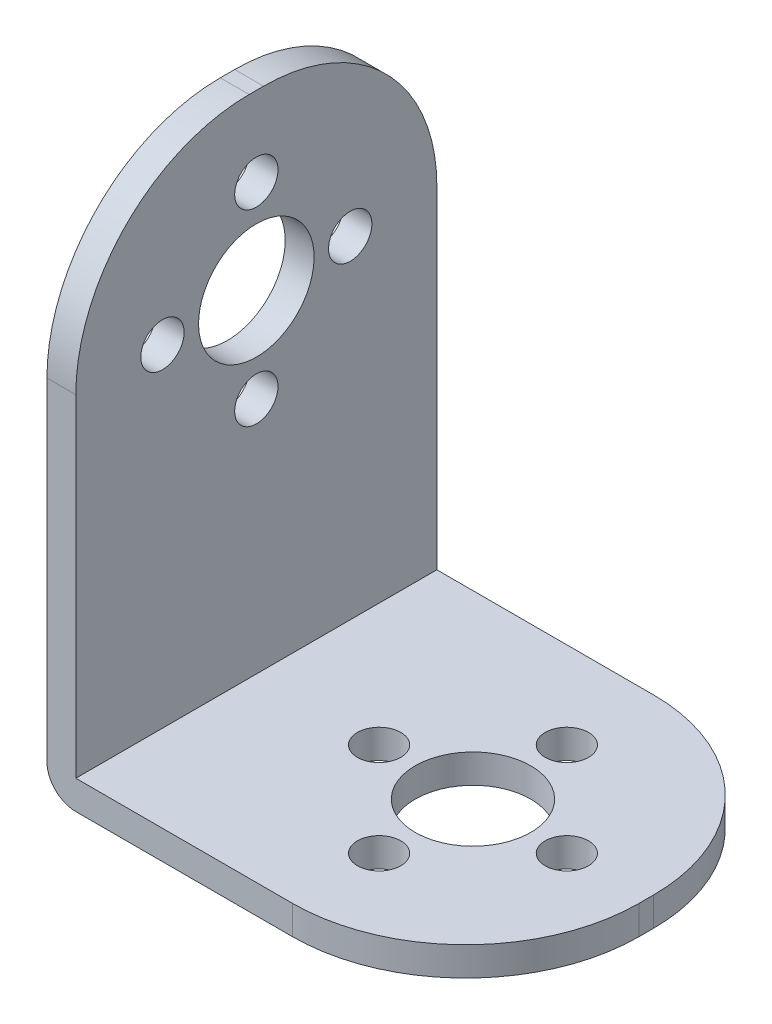
ISO-10303-21;
HEADER;
FILE_DESCRIPTION(('STEP AP214'),'2;1');
FILE_NAME('part.step','',(''),(''),'','','');
FILE_SCHEMA(('AUTOMOTIVE_DESIGN { 1 0 10303 214 1 1 1 1 }'));
ENDSEC;
DATA;
#1=APPLICATION_CONTEXT('core data for automotive mechanical design processes');
#2=APPLICATION_PROTOCOL_DEFINITION('international standard','automotive_design',2000,#1);
#3=PRODUCT_CONTEXT('',#1,'mechanical');
#4=PRODUCT('Part','Part','',(#3));
#5=PRODUCT_RELATED_PRODUCT_CATEGORY('part','',(#4));
#6=PRODUCT_DEFINITION_FORMATION('','',#4);
#7=PRODUCT_DEFINITION_CONTEXT('part definition',#1,'design');
#8=PRODUCT_DEFINITION('design','',#6,#7);
#9=PRODUCT_DEFINITION_SHAPE('','',#8);
#10=(LENGTH_UNIT() NAMED_UNIT(*) SI_UNIT(.MILLI.,.METRE.));
#11=(NAMED_UNIT(*) PLANE_ANGLE_UNIT() SI_UNIT($,.RADIAN.));
#12=(NAMED_UNIT(*) SI_UNIT($,.STERADIAN.) SOLID_ANGLE_UNIT());
#13=UNCERTAINTY_MEASURE_WITH_UNIT(LENGTH_MEASURE(1.E-05),#10,'distance_accuracy_value','');
#14=(GEOMETRIC_REPRESENTATION_CONTEXT(3) GLOBAL_UNCERTAINTY_ASSIGNED_CONTEXT((#13)) GLOBAL_UNIT_ASSIGNED_CONTEXT((#10,
#11,#12)) REPRESENTATION_CONTEXT('',''));
#15=CARTESIAN_POINT('',(0.,0.,0.));
#16=DIRECTION('',(0.,0.,1.));
#17=DIRECTION('',(1.,0.,0.));
#18=AXIS2_PLACEMENT_3D('',#15,#16,#17);
#19=CARTESIAN_POINT('',(0.,37.,0.));
#20=DIRECTION('',(1.,0.,0.));
#21=DIRECTION('',(0.,0.,-1.));
#22=AXIS2_PLACEMENT_3D('',#19,#20,#21);
#23=PLANE('',#22);
#24=CARTESIAN_POINT('',(0.,31.5,-12.5));
#25=DIRECTION('',(1.,0.,0.));
#26=DIRECTION('',(0.,1.,0.));
#27=AXIS2_PLACEMENT_3D('',#24,#25,#26);
#28=CIRCLE('',#27,1.5);
#29=CARTESIAN_POINT('',(0.,33.,-12.5));
#30=VERTEX_POINT('',#29);
#31=EDGE_CURVE('E322',#30,#30,#28,.T.);
#32=ORIENTED_EDGE('',*,*,#31,.T.);
#33=EDGE_LOOP('',(#32));
#34=FACE_BOUND('',#33,.T.);
#35=CARTESIAN_POINT('',(0.,18.5,-12.5));
#36=DIRECTION('',(1.,0.,0.));
#37=DIRECTION('',(0.,1.,0.));
#38=AXIS2_PLACEMENT_3D('',#35,#36,#37);
#39=CIRCLE('',#38,1.5);
#40=CARTESIAN_POINT('',(0.,20.,-12.5));
#41=VERTEX_POINT('',#40);
#42=EDGE_CURVE('E341',#41,#41,#39,.T.);
#43=ORIENTED_EDGE('',*,*,#42,.T.);
#44=EDGE_LOOP('',(#43));
#45=FACE_BOUND('',#44,.T.);
#46=CARTESIAN_POINT('',(0.,25.,-19.));
#47=DIRECTION('',(1.,0.,0.));
#48=DIRECTION('',(0.,-1.,0.));
#49=AXIS2_PLACEMENT_3D('',#46,#47,#48);
#50=CIRCLE('',#49,1.5);
#51=CARTESIAN_POINT('',(0.,23.5,-19.));
#52=VERTEX_POINT('',#51);
#53=EDGE_CURVE('E334',#52,#52,#50,.T.);
#54=ORIENTED_EDGE('',*,*,#53,.T.);
#55=EDGE_LOOP('',(#54));
#56=FACE_BOUND('',#55,.T.);
#57=CARTESIAN_POINT('',(0.,25.,-6.));
#58=DIRECTION('',(1.,0.,0.));
#59=DIRECTION('',(0.,1.,0.));
#60=AXIS2_PLACEMENT_3D('',#57,#58,#59);
#61=CIRCLE('',#60,1.5);
#62=CARTESIAN_POINT('',(0.,26.5,-6.));
#63=VERTEX_POINT('',#62);
#64=EDGE_CURVE('E349',#63,#63,#61,.T.);
#65=ORIENTED_EDGE('',*,*,#64,.T.);
#66=EDGE_LOOP('',(#65));
#67=FACE_BOUND('',#66,.T.);
#68=CARTESIAN_POINT('',(0.,25.,-12.5));
#69=DIRECTION('',(1.,0.,0.));
#70=DIRECTION('',(0.,1.,0.));
#71=AXIS2_PLACEMENT_3D('',#68,#69,#70);
#72=CIRCLE('',#71,4.);
#73=CARTESIAN_POINT('',(0.,29.,-12.5));
#74=VERTEX_POINT('',#73);
#75=EDGE_CURVE('E326',#74,#74,#72,.T.);
#76=ORIENTED_EDGE('',*,*,#75,.T.);
#77=EDGE_LOOP('',(#76));
#78=FACE_BOUND('',#77,.T.);
#79=DIRECTION('',(0.,0.,1.));
#80=VECTOR('',#79,1.);
#81=CARTESIAN_POINT('',(0.,37.,0.));
#82=LINE('',#81,#80);
#83=CARTESIAN_POINT('',(0.,37.,-13.));
#84=VERTEX_POINT('',#83);
#85=CARTESIAN_POINT('',(0.,37.,-12.));
#86=VERTEX_POINT('',#85);
#87=EDGE_CURVE('E149',#84,#86,#82,.T.);
#88=ORIENTED_EDGE('',*,*,#87,.F.);
#89=CARTESIAN_POINT('',(0.,25.,-13.));
#90=DIRECTION('',(1.,0.,0.));
#91=DIRECTION('',(0.,0.,-1.));
#92=AXIS2_PLACEMENT_3D('',#89,#90,#91);
#93=CIRCLE('',#92,12.);
#94=CARTESIAN_POINT('',(0.,25.,-25.));
#95=VERTEX_POINT('',#94);
#96=EDGE_CURVE('E202',#84,#95,#93,.F.);
#97=ORIENTED_EDGE('',*,*,#96,.T.);
#98=DIRECTION('',(0.,-1.,0.));
#99=VECTOR('',#98,1.);
#100=CARTESIAN_POINT('',(0.,37.,-25.));
#101=LINE('',#100,#99);
#102=CARTESIAN_POINT('',(0.,2.,-25.));
#103=VERTEX_POINT('',#102);
#104=EDGE_CURVE('E152',#95,#103,#101,.T.);
#105=ORIENTED_EDGE('',*,*,#104,.T.);
#106=DIRECTION('',(0.,0.,1.));
#107=VECTOR('',#106,1.);
#108=CARTESIAN_POINT('',(0.,2.,0.));
#109=LINE('',#108,#107);
#110=CARTESIAN_POINT('',(0.,2.,0.));
#111=VERTEX_POINT('',#110);
#112=EDGE_CURVE('E166',#103,#111,#109,.T.);
#113=ORIENTED_EDGE('',*,*,#112,.T.);
#114=DIRECTION('',(0.,-1.,0.));
#115=VECTOR('',#114,1.);
#116=CARTESIAN_POINT('',(0.,37.,0.));
#117=LINE('',#116,#115);
#118=CARTESIAN_POINT('',(0.,25.,0.));
#119=VERTEX_POINT('',#118);
#120=EDGE_CURVE('E160',#119,#111,#117,.T.);
#121=ORIENTED_EDGE('',*,*,#120,.F.);
#122=CARTESIAN_POINT('',(0.,25.,-12.));
#123=DIRECTION('',(1.,0.,0.));
#124=DIRECTION('',(0.,0.,-1.));
#125=AXIS2_PLACEMENT_3D('',#122,#123,#124);
#126=CIRCLE('',#125,12.);
#127=EDGE_CURVE('E200',#119,#86,#126,.F.);
#128=ORIENTED_EDGE('',*,*,#127,.T.);
#129=EDGE_LOOP('',(#88,#97,#105,#113,#121,#128));
#130=FACE_BOUND('',#129,.T.);
#131=ADVANCED_FACE('F37',(#34,#45,#56,#67,#78,#130),#23,.F.);
#132=CARTESIAN_POINT('',(0.,37.,0.));
#133=DIRECTION('',(0.,0.,-1.));
#134=DIRECTION('',(-1.,0.,0.));
#135=AXIS2_PLACEMENT_3D('',#132,#133,#134);
#136=PLANE('',#135);
#137=DIRECTION('',(0.,-1.,0.));
#138=VECTOR('',#137,1.);
#139=CARTESIAN_POINT('',(2.,37.,0.));
#140=LINE('',#139,#138);
#141=CARTESIAN_POINT('',(2.,25.,0.));
#142=VERTEX_POINT('',#141);
#143=CARTESIAN_POINT('',(2.,2.,0.));
#144=VERTEX_POINT('',#143);
#145=EDGE_CURVE('E118',#142,#144,#140,.T.);
#146=ORIENTED_EDGE('',*,*,#145,.F.);
#147=DIRECTION('',(1.,0.,0.));
#148=VECTOR('',#147,1.);
#149=CARTESIAN_POINT('',(0.,25.,0.));
#150=LINE('',#149,#148);
#151=EDGE_CURVE('E11',#142,#119,#150,.F.);
#152=ORIENTED_EDGE('',*,*,#151,.T.);
#153=ORIENTED_EDGE('',*,*,#120,.T.);
#154=CARTESIAN_POINT('',(2.,2.,0.));
#155=DIRECTION('',(0.,0.,-1.));
#156=DIRECTION('',(-1.,0.,0.));
#157=AXIS2_PLACEMENT_3D('',#154,#155,#156);
#158=CIRCLE('',#157,2.);
#159=CARTESIAN_POINT('',(2.,0.,0.));
#160=VERTEX_POINT('',#159);
#161=EDGE_CURVE('E169',#111,#160,#158,.F.);
#162=ORIENTED_EDGE('',*,*,#161,.T.);
#163=DIRECTION('',(1.,0.,0.));
#164=VECTOR('',#163,1.);
#165=CARTESIAN_POINT('',(0.,0.,0.));
#166=LINE('',#165,#164);
#167=CARTESIAN_POINT('',(17.,0.,0.));
#168=VERTEX_POINT('',#167);
#169=EDGE_CURVE('E148',#160,#168,#166,.T.);
#170=ORIENTED_EDGE('',*,*,#169,.T.);
#171=DIRECTION('',(0.,-1.,0.));
#172=VECTOR('',#171,1.);
#173=CARTESIAN_POINT('',(17.,37.,0.));
#174=LINE('',#173,#172);
#175=CARTESIAN_POINT('',(17.,2.,0.));
#176=VERTEX_POINT('',#175);
#177=EDGE_CURVE('E140',#168,#176,#174,.F.);
#178=ORIENTED_EDGE('',*,*,#177,.T.);
#179=DIRECTION('',(1.,0.,0.));
#180=VECTOR('',#179,1.);
#181=CARTESIAN_POINT('',(2.,2.,0.));
#182=LINE('',#181,#180);
#183=EDGE_CURVE('E125',#144,#176,#182,.T.);
#184=ORIENTED_EDGE('',*,*,#183,.F.);
#185=EDGE_LOOP('',(#146,#152,#153,#162,#170,#178,#184));
#186=FACE_BOUND('',#185,.T.);
#187=ADVANCED_FACE('F137',(#186),#136,.F.);
#188=CARTESIAN_POINT('',(29.,37.,0.));
#189=DIRECTION('',(-1.,0.,0.));
#190=DIRECTION('',(0.,0.,1.));
#191=AXIS2_PLACEMENT_3D('',#188,#189,#190);
#192=PLANE('',#191);
#193=DIRECTION('',(0.,0.,1.));
#194=VECTOR('',#193,1.);
#195=CARTESIAN_POINT('',(29.,2.,-37.));
#196=LINE('',#195,#194);
#197=CARTESIAN_POINT('',(29.,2.,-13.));
#198=VERTEX_POINT('',#197);
#199=CARTESIAN_POINT('',(29.,2.,-12.));
#200=VERTEX_POINT('',#199);
#201=EDGE_CURVE('E135',#198,#200,#196,.T.);
#202=ORIENTED_EDGE('',*,*,#201,.T.);
#203=DIRECTION('',(0.,-1.,0.));
#204=VECTOR('',#203,1.);
#205=CARTESIAN_POINT('',(29.,37.,-12.));
#206=LINE('',#205,#204);
#207=CARTESIAN_POINT('',(29.,0.,-12.));
#208=VERTEX_POINT('',#207);
#209=EDGE_CURVE('E179',#200,#208,#206,.T.);
#210=ORIENTED_EDGE('',*,*,#209,.T.);
#211=DIRECTION('',(0.,0.,-1.));
#212=VECTOR('',#211,1.);
#213=CARTESIAN_POINT('',(29.,0.,0.));
#214=LINE('',#213,#212);
#215=CARTESIAN_POINT('',(29.,0.,-13.));
#216=VERTEX_POINT('',#215);
#217=EDGE_CURVE('E155',#208,#216,#214,.T.);
#218=ORIENTED_EDGE('',*,*,#217,.T.);
#219=DIRECTION('',(0.,-1.,0.));
#220=VECTOR('',#219,1.);
#221=CARTESIAN_POINT('',(29.,37.,-13.));
#222=LINE('',#221,#220);
#223=EDGE_CURVE('E177',#216,#198,#222,.F.);
#224=ORIENTED_EDGE('',*,*,#223,.T.);
#225=EDGE_LOOP('',(#202,#210,#218,#224));
#226=FACE_BOUND('',#225,.T.);
#227=ADVANCED_FACE('F241',(#226),#192,.F.);
#228=CARTESIAN_POINT('',(0.,37.,-25.));
#229=DIRECTION('',(0.,0.,1.));
#230=DIRECTION('',(1.,0.,0.));
#231=AXIS2_PLACEMENT_3D('',#228,#229,#230);
#232=PLANE('',#231);
#233=ORIENTED_EDGE('',*,*,#104,.F.);
#234=DIRECTION('',(-1.,0.,0.));
#235=VECTOR('',#234,1.);
#236=CARTESIAN_POINT('',(0.,25.,-25.));
#237=LINE('',#236,#235);
#238=CARTESIAN_POINT('',(2.,25.,-25.));
#239=VERTEX_POINT('',#238);
#240=EDGE_CURVE('E60',#95,#239,#237,.F.);
#241=ORIENTED_EDGE('',*,*,#240,.T.);
#242=DIRECTION('',(0.,-1.,0.));
#243=VECTOR('',#242,1.);
#244=CARTESIAN_POINT('',(2.,37.,-25.));
#245=LINE('',#244,#243);
#246=CARTESIAN_POINT('',(2.,2.,-25.));
#247=VERTEX_POINT('',#246);
#248=EDGE_CURVE('E145',#239,#247,#245,.T.);
#249=ORIENTED_EDGE('',*,*,#248,.T.);
#250=DIRECTION('',(1.,0.,0.));
#251=VECTOR('',#250,1.);
#252=CARTESIAN_POINT('',(0.,2.,-25.));
#253=LINE('',#252,#251);
#254=CARTESIAN_POINT('',(17.,2.,-25.));
#255=VERTEX_POINT('',#254);
#256=EDGE_CURVE('E134',#247,#255,#253,.T.);
#257=ORIENTED_EDGE('',*,*,#256,.T.);
#258=DIRECTION('',(0.,-1.,0.));
#259=VECTOR('',#258,1.);
#260=CARTESIAN_POINT('',(17.,37.,-25.));
#261=LINE('',#260,#259);
#262=CARTESIAN_POINT('',(17.,0.,-25.));
#263=VERTEX_POINT('',#262);
#264=EDGE_CURVE('E191',#255,#263,#261,.T.);
#265=ORIENTED_EDGE('',*,*,#264,.T.);
#266=DIRECTION('',(-1.,0.,0.));
#267=VECTOR('',#266,1.);
#268=CARTESIAN_POINT('',(0.,0.,-25.));
#269=LINE('',#268,#267);
#270=CARTESIAN_POINT('',(2.,0.,-25.));
#271=VERTEX_POINT('',#270);
#272=EDGE_CURVE('E153',#263,#271,#269,.T.);
#273=ORIENTED_EDGE('',*,*,#272,.T.);
#274=CARTESIAN_POINT('',(2.,2.,-25.));
#275=DIRECTION('',(0.,0.,1.));
#276=DIRECTION('',(1.,0.,0.));
#277=AXIS2_PLACEMENT_3D('',#274,#275,#276);
#278=CIRCLE('',#277,2.);
#279=EDGE_CURVE('E174',#271,#103,#278,.F.);
#280=ORIENTED_EDGE('',*,*,#279,.T.);
#281=EDGE_LOOP('',(#233,#241,#249,#257,#265,#273,#280));
#282=FACE_BOUND('',#281,.T.);
#283=ADVANCED_FACE('F214',(#282),#232,.F.);
#284=CARTESIAN_POINT('',(0.,37.,0.));
#285=DIRECTION('',(0.,-1.,0.));
#286=DIRECTION('',(0.,0.,-1.));
#287=AXIS2_PLACEMENT_3D('',#284,#285,#286);
#288=PLANE('',#287);
#289=DIRECTION('',(0.,0.,-1.));
#290=VECTOR('',#289,1.);
#291=CARTESIAN_POINT('',(2.,37.,0.));
#292=LINE('',#291,#290);
#293=CARTESIAN_POINT('',(2.,37.,-12.));
#294=VERTEX_POINT('',#293);
#295=CARTESIAN_POINT('',(2.,37.,-13.));
#296=VERTEX_POINT('',#295);
#297=EDGE_CURVE('E162',#294,#296,#292,.T.);
#298=ORIENTED_EDGE('',*,*,#297,.T.);
#299=DIRECTION('',(-1.,0.,0.));
#300=VECTOR('',#299,1.);
#301=CARTESIAN_POINT('',(0.,37.,-13.));
#302=LINE('',#301,#300);
#303=EDGE_CURVE('E197',#296,#84,#302,.T.);
#304=ORIENTED_EDGE('',*,*,#303,.T.);
#305=ORIENTED_EDGE('',*,*,#87,.T.);
#306=DIRECTION('',(1.,0.,0.));
#307=VECTOR('',#306,1.);
#308=CARTESIAN_POINT('',(0.,37.,-12.));
#309=LINE('',#308,#307);
#310=EDGE_CURVE('E194',#86,#294,#309,.T.);
#311=ORIENTED_EDGE('',*,*,#310,.T.);
#312=EDGE_LOOP('',(#298,#304,#305,#311));
#313=FACE_BOUND('',#312,.T.);
#314=ADVANCED_FACE('F209',(#313),#288,.F.);
#315=CARTESIAN_POINT('',(0.,0.,0.));
#316=DIRECTION('',(0.,-1.,0.));
#317=DIRECTION('',(0.,0.,-1.));
#318=AXIS2_PLACEMENT_3D('',#315,#316,#317);
#319=PLANE('',#318);
#320=CARTESIAN_POINT('',(23.5,0.,-12.5));
#321=DIRECTION('',(0.,1.,0.));
#322=DIRECTION('',(-1.,0.,0.));
#323=AXIS2_PLACEMENT_3D('',#320,#321,#322);
#324=CIRCLE('',#323,1.5);
#325=CARTESIAN_POINT('',(22.,0.,-12.5));
#326=VERTEX_POINT('',#325);
#327=EDGE_CURVE('E126',#326,#326,#324,.T.);
#328=ORIENTED_EDGE('',*,*,#327,.T.);
#329=EDGE_LOOP('',(#328));
#330=FACE_BOUND('',#329,.T.);
#331=CARTESIAN_POINT('',(17.,0.,-6.));
#332=DIRECTION('',(0.,1.,0.));
#333=DIRECTION('',(1.,0.,0.));
#334=AXIS2_PLACEMENT_3D('',#331,#332,#333);
#335=CIRCLE('',#334,1.5);
#336=CARTESIAN_POINT('',(18.5,0.,-6.));
#337=VERTEX_POINT('',#336);
#338=EDGE_CURVE('E367',#337,#337,#335,.T.);
#339=ORIENTED_EDGE('',*,*,#338,.T.);
#340=EDGE_LOOP('',(#339));
#341=FACE_BOUND('',#340,.T.);
#342=CARTESIAN_POINT('',(17.,0.,-19.));
#343=DIRECTION('',(0.,1.,0.));
#344=DIRECTION('',(-1.,0.,0.));
#345=AXIS2_PLACEMENT_3D('',#342,#343,#344);
#346=CIRCLE('',#345,1.5);
#347=CARTESIAN_POINT('',(15.5,0.,-19.));
#348=VERTEX_POINT('',#347);
#349=EDGE_CURVE('E360',#348,#348,#346,.T.);
#350=ORIENTED_EDGE('',*,*,#349,.T.);
#351=EDGE_LOOP('',(#350));
#352=FACE_BOUND('',#351,.T.);
#353=CARTESIAN_POINT('',(10.5,0.,-12.5));
#354=DIRECTION('',(0.,1.,0.));
#355=DIRECTION('',(-1.,0.,0.));
#356=AXIS2_PLACEMENT_3D('',#353,#354,#355);
#357=CIRCLE('',#356,1.5);
#358=CARTESIAN_POINT('',(9.00000000000001,0.,-12.5));
#359=VERTEX_POINT('',#358);
#360=EDGE_CURVE('E377',#359,#359,#357,.T.);
#361=ORIENTED_EDGE('',*,*,#360,.T.);
#362=EDGE_LOOP('',(#361));
#363=FACE_BOUND('',#362,.T.);
#364=CARTESIAN_POINT('',(17.,0.,-12.5));
#365=DIRECTION('',(0.,1.,0.));
#366=DIRECTION('',(-1.,0.,0.));
#367=AXIS2_PLACEMENT_3D('',#364,#365,#366);
#368=CIRCLE('',#367,4.);
#369=CARTESIAN_POINT('',(13.,0.,-12.5));
#370=VERTEX_POINT('',#369);
#371=EDGE_CURVE('E359',#370,#370,#368,.T.);
#372=ORIENTED_EDGE('',*,*,#371,.T.);
#373=EDGE_LOOP('',(#372));
#374=FACE_BOUND('',#373,.T.);
#375=ORIENTED_EDGE('',*,*,#217,.F.);
#376=CARTESIAN_POINT('',(17.,0.,-12.));
#377=DIRECTION('',(0.,-1.,0.));
#378=DIRECTION('',(0.,0.,-1.));
#379=AXIS2_PLACEMENT_3D('',#376,#377,#378);
#380=CIRCLE('',#379,12.);
#381=EDGE_CURVE('E184',#208,#168,#380,.T.);
#382=ORIENTED_EDGE('',*,*,#381,.T.);
#383=ORIENTED_EDGE('',*,*,#169,.F.);
#384=DIRECTION('',(0.,0.,1.));
#385=VECTOR('',#384,1.);
#386=CARTESIAN_POINT('',(2.,0.,-25.));
#387=LINE('',#386,#385);
#388=EDGE_CURVE('E171',#160,#271,#387,.F.);
#389=ORIENTED_EDGE('',*,*,#388,.T.);
#390=ORIENTED_EDGE('',*,*,#272,.F.);
#391=CARTESIAN_POINT('',(17.,0.,-13.));
#392=DIRECTION('',(0.,-1.,0.));
#393=DIRECTION('',(0.,0.,-1.));
#394=AXIS2_PLACEMENT_3D('',#391,#392,#393);
#395=CIRCLE('',#394,12.);
#396=EDGE_CURVE('E182',#263,#216,#395,.T.);
#397=ORIENTED_EDGE('',*,*,#396,.T.);
#398=EDGE_LOOP('',(#375,#382,#383,#389,#390,#397));
#399=FACE_BOUND('',#398,.T.);
#400=ADVANCED_FACE('F265',(#330,#341,#352,#363,#374,#399),#319,.T.);
#401=CARTESIAN_POINT('',(2.,2.,-37.));
#402=DIRECTION('',(0.,-1.,0.));
#403=DIRECTION('',(1.,0.,0.));
#404=AXIS2_PLACEMENT_3D('',#401,#402,#403);
#405=PLANE('',#404);
#406=CARTESIAN_POINT('',(23.5,2.,-12.5));
#407=DIRECTION('',(0.,1.,0.));
#408=DIRECTION('',(-1.,0.,0.));
#409=AXIS2_PLACEMENT_3D('',#406,#407,#408);
#410=CIRCLE('',#409,1.5);
#411=CARTESIAN_POINT('',(22.,2.,-12.5));
#412=VERTEX_POINT('',#411);
#413=EDGE_CURVE('E356',#412,#412,#410,.T.);
#414=ORIENTED_EDGE('',*,*,#413,.F.);
#415=EDGE_LOOP('',(#414));
#416=FACE_BOUND('',#415,.T.);
#417=CARTESIAN_POINT('',(17.,2.,-6.));
#418=DIRECTION('',(0.,1.,0.));
#419=DIRECTION('',(1.,0.,0.));
#420=AXIS2_PLACEMENT_3D('',#417,#418,#419);
#421=CIRCLE('',#420,1.5);
#422=CARTESIAN_POINT('',(18.5,2.,-6.));
#423=VERTEX_POINT('',#422);
#424=EDGE_CURVE('E328',#423,#423,#421,.T.);
#425=ORIENTED_EDGE('',*,*,#424,.F.);
#426=EDGE_LOOP('',(#425));
#427=FACE_BOUND('',#426,.T.);
#428=CARTESIAN_POINT('',(17.,2.,-19.));
#429=DIRECTION('',(0.,1.,0.));
#430=DIRECTION('',(-1.,0.,0.));
#431=AXIS2_PLACEMENT_3D('',#428,#429,#430);
#432=CIRCLE('',#431,1.5);
#433=CARTESIAN_POINT('',(15.5,2.,-19.));
#434=VERTEX_POINT('',#433);
#435=EDGE_CURVE('E364',#434,#434,#432,.T.);
#436=ORIENTED_EDGE('',*,*,#435,.F.);
#437=EDGE_LOOP('',(#436));
#438=FACE_BOUND('',#437,.T.);
#439=CARTESIAN_POINT('',(10.5,2.,-12.5));
#440=DIRECTION('',(0.,1.,0.));
#441=DIRECTION('',(-1.,0.,0.));
#442=AXIS2_PLACEMENT_3D('',#439,#440,#441);
#443=CIRCLE('',#442,1.5);
#444=CARTESIAN_POINT('',(9.00000000000001,2.,-12.5));
#445=VERTEX_POINT('',#444);
#446=EDGE_CURVE('E363',#445,#445,#443,.T.);
#447=ORIENTED_EDGE('',*,*,#446,.F.);
#448=EDGE_LOOP('',(#447));
#449=FACE_BOUND('',#448,.T.);
#450=CARTESIAN_POINT('',(17.,2.,-12.5));
#451=DIRECTION('',(0.,1.,0.));
#452=DIRECTION('',(-1.,0.,0.));
#453=AXIS2_PLACEMENT_3D('',#450,#451,#452);
#454=CIRCLE('',#453,4.);
#455=CARTESIAN_POINT('',(13.,2.,-12.5));
#456=VERTEX_POINT('',#455);
#457=EDGE_CURVE('E374',#456,#456,#454,.T.);
#458=ORIENTED_EDGE('',*,*,#457,.F.);
#459=EDGE_LOOP('',(#458));
#460=FACE_BOUND('',#459,.T.);
#461=ORIENTED_EDGE('',*,*,#183,.T.);
#462=CARTESIAN_POINT('',(17.,2.,-12.));
#463=DIRECTION('',(0.,-1.,0.));
#464=DIRECTION('',(1.,0.,0.));
#465=AXIS2_PLACEMENT_3D('',#462,#463,#464);
#466=CIRCLE('',#465,12.);
#467=EDGE_CURVE('E189',#176,#200,#466,.F.);
#468=ORIENTED_EDGE('',*,*,#467,.T.);
#469=ORIENTED_EDGE('',*,*,#201,.F.);
#470=CARTESIAN_POINT('',(17.,2.,-13.));
#471=DIRECTION('',(0.,-1.,0.));
#472=DIRECTION('',(1.,0.,0.));
#473=AXIS2_PLACEMENT_3D('',#470,#471,#472);
#474=CIRCLE('',#473,12.);
#475=EDGE_CURVE('E187',#198,#255,#474,.F.);
#476=ORIENTED_EDGE('',*,*,#475,.T.);
#477=ORIENTED_EDGE('',*,*,#256,.F.);
#478=DIRECTION('',(0.,0.,1.));
#479=VECTOR('',#478,1.);
#480=CARTESIAN_POINT('',(2.,2.,-37.));
#481=LINE('',#480,#479);
#482=EDGE_CURVE('E121',#247,#144,#481,.T.);
#483=ORIENTED_EDGE('',*,*,#482,.T.);
#484=EDGE_LOOP('',(#461,#468,#469,#476,#477,#483));
#485=FACE_BOUND('',#484,.T.);
#486=ADVANCED_FACE('F131',(#416,#427,#438,#449,#460,#485),#405,.F.);
#487=CARTESIAN_POINT('',(2.,37.,-37.));
#488=DIRECTION('',(-1.,0.,0.));
#489=DIRECTION('',(0.,-1.,0.));
#490=AXIS2_PLACEMENT_3D('',#487,#488,#489);
#491=PLANE('',#490);
#492=CARTESIAN_POINT('',(2.,31.5,-12.5));
#493=DIRECTION('',(1.,0.,0.));
#494=DIRECTION('',(0.,1.,0.));
#495=AXIS2_PLACEMENT_3D('',#492,#493,#494);
#496=CIRCLE('',#495,1.5);
#497=CARTESIAN_POINT('',(2.,33.,-12.5));
#498=VERTEX_POINT('',#497);
#499=EDGE_CURVE('E325',#498,#498,#496,.T.);
#500=ORIENTED_EDGE('',*,*,#499,.F.);
#501=EDGE_LOOP('',(#500));
#502=FACE_BOUND('',#501,.T.);
#503=CARTESIAN_POINT('',(2.,18.5,-12.5));
#504=DIRECTION('',(1.,0.,0.));
#505=DIRECTION('',(0.,1.,0.));
#506=AXIS2_PLACEMENT_3D('',#503,#504,#505);
#507=CIRCLE('',#506,1.5);
#508=CARTESIAN_POINT('',(2.,20.,-12.5));
#509=VERTEX_POINT('',#508);
#510=EDGE_CURVE('E344',#509,#509,#507,.T.);
#511=ORIENTED_EDGE('',*,*,#510,.F.);
#512=EDGE_LOOP('',(#511));
#513=FACE_BOUND('',#512,.T.);
#514=CARTESIAN_POINT('',(2.,25.,-19.));
#515=DIRECTION('',(1.,0.,0.));
#516=DIRECTION('',(0.,-1.,0.));
#517=AXIS2_PLACEMENT_3D('',#514,#515,#516);
#518=CIRCLE('',#517,1.5);
#519=CARTESIAN_POINT('',(2.,23.5,-19.));
#520=VERTEX_POINT('',#519);
#521=EDGE_CURVE('E338',#520,#520,#518,.T.);
#522=ORIENTED_EDGE('',*,*,#521,.F.);
#523=EDGE_LOOP('',(#522));
#524=FACE_BOUND('',#523,.T.);
#525=CARTESIAN_POINT('',(2.,25.,-6.));
#526=DIRECTION('',(1.,0.,0.));
#527=DIRECTION('',(0.,1.,0.));
#528=AXIS2_PLACEMENT_3D('',#525,#526,#527);
#529=CIRCLE('',#528,1.5);
#530=CARTESIAN_POINT('',(2.,26.5,-6.));
#531=VERTEX_POINT('',#530);
#532=EDGE_CURVE('E337',#531,#531,#529,.T.);
#533=ORIENTED_EDGE('',*,*,#532,.F.);
#534=EDGE_LOOP('',(#533));
#535=FACE_BOUND('',#534,.T.);
#536=CARTESIAN_POINT('',(2.,25.,-12.5));
#537=DIRECTION('',(1.,0.,0.));
#538=DIRECTION('',(0.,1.,0.));
#539=AXIS2_PLACEMENT_3D('',#536,#537,#538);
#540=CIRCLE('',#539,4.);
#541=CARTESIAN_POINT('',(2.,29.,-12.5));
#542=VERTEX_POINT('',#541);
#543=EDGE_CURVE('E331',#542,#542,#540,.T.);
#544=ORIENTED_EDGE('',*,*,#543,.F.);
#545=EDGE_LOOP('',(#544));
#546=FACE_BOUND('',#545,.T.);
#547=ORIENTED_EDGE('',*,*,#248,.F.);
#548=CARTESIAN_POINT('',(2.,25.,-13.));
#549=DIRECTION('',(-1.,0.,0.));
#550=DIRECTION('',(0.,-1.,0.));
#551=AXIS2_PLACEMENT_3D('',#548,#549,#550);
#552=CIRCLE('',#551,12.);
#553=EDGE_CURVE('E45',#239,#296,#552,.F.);
#554=ORIENTED_EDGE('',*,*,#553,.T.);
#555=ORIENTED_EDGE('',*,*,#297,.F.);
#556=CARTESIAN_POINT('',(2.,25.,-12.));
#557=DIRECTION('',(-1.,0.,0.));
#558=DIRECTION('',(0.,-1.,0.));
#559=AXIS2_PLACEMENT_3D('',#556,#557,#558);
#560=CIRCLE('',#559,12.);
#561=EDGE_CURVE('E52',#294,#142,#560,.F.);
#562=ORIENTED_EDGE('',*,*,#561,.T.);
#563=ORIENTED_EDGE('',*,*,#145,.T.);
#564=ORIENTED_EDGE('',*,*,#482,.F.);
#565=EDGE_LOOP('',(#547,#554,#555,#562,#563,#564));
#566=FACE_BOUND('',#565,.T.);
#567=ADVANCED_FACE('F120',(#502,#513,#524,#535,#546,#566),#491,.F.);
#568=CARTESIAN_POINT('',(2.,2.,0.));
#569=DIRECTION('',(0.,0.,-1.));
#570=DIRECTION('',(-1.,0.,0.));
#571=AXIS2_PLACEMENT_3D('',#568,#569,#570);
#572=CYLINDRICAL_SURFACE('',#571,2.);
#573=ORIENTED_EDGE('',*,*,#279,.F.);
#574=ORIENTED_EDGE('',*,*,#388,.F.);
#575=ORIENTED_EDGE('',*,*,#161,.F.);
#576=ORIENTED_EDGE('',*,*,#112,.F.);
#577=EDGE_LOOP('',(#573,#574,#575,#576));
#578=FACE_BOUND('',#577,.T.);
#579=ADVANCED_FACE('F221',(#578),#572,.T.);
#580=CARTESIAN_POINT('',(17.,0.,-12.5));
#581=DIRECTION('',(0.,1.,0.));
#582=DIRECTION('',(-1.,0.,0.));
#583=AXIS2_PLACEMENT_3D('',#580,#581,#582);
#584=CYLINDRICAL_SURFACE('',#583,4.);
#585=ORIENTED_EDGE('',*,*,#371,.F.);
#586=EDGE_LOOP('',(#585));
#587=FACE_BOUND('',#586,.T.);
#588=ORIENTED_EDGE('',*,*,#457,.T.);
#589=EDGE_LOOP('',(#588));
#590=FACE_BOUND('',#589,.T.);
#591=ADVANCED_FACE('F249',(#587,#590),#584,.F.);
#592=CARTESIAN_POINT('',(10.5,0.,-12.5));
#593=DIRECTION('',(0.,1.,0.));
#594=DIRECTION('',(-1.,0.,0.));
#595=AXIS2_PLACEMENT_3D('',#592,#593,#594);
#596=CYLINDRICAL_SURFACE('',#595,1.5);
#597=ORIENTED_EDGE('',*,*,#360,.F.);
#598=EDGE_LOOP('',(#597));
#599=FACE_BOUND('',#598,.T.);
#600=ORIENTED_EDGE('',*,*,#446,.T.);
#601=EDGE_LOOP('',(#600));
#602=FACE_BOUND('',#601,.T.);
#603=ADVANCED_FACE('F286',(#599,#602),#596,.F.);
#604=CARTESIAN_POINT('',(17.,0.,-19.));
#605=DIRECTION('',(0.,1.,0.));
#606=DIRECTION('',(-1.,0.,0.));
#607=AXIS2_PLACEMENT_3D('',#604,#605,#606);
#608=CYLINDRICAL_SURFACE('',#607,1.5);
#609=ORIENTED_EDGE('',*,*,#349,.F.);
#610=EDGE_LOOP('',(#609));
#611=FACE_BOUND('',#610,.T.);
#612=ORIENTED_EDGE('',*,*,#435,.T.);
#613=EDGE_LOOP('',(#612));
#614=FACE_BOUND('',#613,.T.);
#615=ADVANCED_FACE('F289',(#611,#614),#608,.F.);
#616=CARTESIAN_POINT('',(17.,0.,-6.));
#617=DIRECTION('',(0.,1.,0.));
#618=DIRECTION('',(-1.,0.,0.));
#619=AXIS2_PLACEMENT_3D('',#616,#617,#618);
#620=CYLINDRICAL_SURFACE('',#619,1.5);
#621=ORIENTED_EDGE('',*,*,#338,.F.);
#622=EDGE_LOOP('',(#621));
#623=FACE_BOUND('',#622,.T.);
#624=ORIENTED_EDGE('',*,*,#424,.T.);
#625=EDGE_LOOP('',(#624));
#626=FACE_BOUND('',#625,.T.);
#627=ADVANCED_FACE('F294',(#623,#626),#620,.F.);
#628=CARTESIAN_POINT('',(23.5,0.,-12.5));
#629=DIRECTION('',(0.,1.,0.));
#630=DIRECTION('',(-1.,0.,0.));
#631=AXIS2_PLACEMENT_3D('',#628,#629,#630);
#632=CYLINDRICAL_SURFACE('',#631,1.5);
#633=ORIENTED_EDGE('',*,*,#327,.F.);
#634=EDGE_LOOP('',(#633));
#635=FACE_BOUND('',#634,.T.);
#636=ORIENTED_EDGE('',*,*,#413,.T.);
#637=EDGE_LOOP('',(#636));
#638=FACE_BOUND('',#637,.T.);
#639=ADVANCED_FACE('F253',(#635,#638),#632,.F.);
#640=CARTESIAN_POINT('',(17.,37.,-12.));
#641=DIRECTION('',(0.,-1.,0.));
#642=DIRECTION('',(0.,0.,-1.));
#643=AXIS2_PLACEMENT_3D('',#640,#641,#642);
#644=CYLINDRICAL_SURFACE('',#643,12.);
#645=ORIENTED_EDGE('',*,*,#467,.F.);
#646=ORIENTED_EDGE('',*,*,#177,.F.);
#647=ORIENTED_EDGE('',*,*,#381,.F.);
#648=ORIENTED_EDGE('',*,*,#209,.F.);
#649=EDGE_LOOP('',(#645,#646,#647,#648));
#650=FACE_BOUND('',#649,.T.);
#651=ADVANCED_FACE('F250',(#650),#644,.T.);
#652=CARTESIAN_POINT('',(17.,37.,-13.));
#653=DIRECTION('',(0.,-1.,0.));
#654=DIRECTION('',(0.,0.,-1.));
#655=AXIS2_PLACEMENT_3D('',#652,#653,#654);
#656=CYLINDRICAL_SURFACE('',#655,12.);
#657=ORIENTED_EDGE('',*,*,#475,.F.);
#658=ORIENTED_EDGE('',*,*,#223,.F.);
#659=ORIENTED_EDGE('',*,*,#396,.F.);
#660=ORIENTED_EDGE('',*,*,#264,.F.);
#661=EDGE_LOOP('',(#657,#658,#659,#660));
#662=FACE_BOUND('',#661,.T.);
#663=ADVANCED_FACE('F234',(#662),#656,.T.);
#664=CARTESIAN_POINT('',(0.,25.,-13.));
#665=DIRECTION('',(-1.,0.,0.));
#666=DIRECTION('',(0.,0.,1.));
#667=AXIS2_PLACEMENT_3D('',#664,#665,#666);
#668=CYLINDRICAL_SURFACE('',#667,12.);
#669=ORIENTED_EDGE('',*,*,#553,.F.);
#670=ORIENTED_EDGE('',*,*,#240,.F.);
#671=ORIENTED_EDGE('',*,*,#96,.F.);
#672=ORIENTED_EDGE('',*,*,#303,.F.);
#673=EDGE_LOOP('',(#669,#670,#671,#672));
#674=FACE_BOUND('',#673,.T.);
#675=ADVANCED_FACE('F212',(#674),#668,.T.);
#676=CARTESIAN_POINT('',(0.,25.,-12.));
#677=DIRECTION('',(1.,0.,0.));
#678=DIRECTION('',(0.,0.,-1.));
#679=AXIS2_PLACEMENT_3D('',#676,#677,#678);
#680=CYLINDRICAL_SURFACE('',#679,12.);
#681=ORIENTED_EDGE('',*,*,#127,.F.);
#682=ORIENTED_EDGE('',*,*,#151,.F.);
#683=ORIENTED_EDGE('',*,*,#561,.F.);
#684=ORIENTED_EDGE('',*,*,#310,.F.);
#685=EDGE_LOOP('',(#681,#682,#683,#684));
#686=FACE_BOUND('',#685,.T.);
#687=ADVANCED_FACE('F39',(#686),#680,.T.);
#688=CARTESIAN_POINT('',(0.,25.,-12.5));
#689=DIRECTION('',(1.,0.,0.));
#690=DIRECTION('',(0.,1.,0.));
#691=AXIS2_PLACEMENT_3D('',#688,#689,#690);
#692=CYLINDRICAL_SURFACE('',#691,4.);
#693=ORIENTED_EDGE('',*,*,#75,.F.);
#694=EDGE_LOOP('',(#693));
#695=FACE_BOUND('',#694,.T.);
#696=ORIENTED_EDGE('',*,*,#543,.T.);
#697=EDGE_LOOP('',(#696));
#698=FACE_BOUND('',#697,.T.);
#699=ADVANCED_FACE('F226',(#695,#698),#692,.F.);
#700=CARTESIAN_POINT('',(0.,25.,-6.));
#701=DIRECTION('',(1.,0.,0.));
#702=DIRECTION('',(0.,1.,0.));
#703=AXIS2_PLACEMENT_3D('',#700,#701,#702);
#704=CYLINDRICAL_SURFACE('',#703,1.5);
#705=ORIENTED_EDGE('',*,*,#64,.F.);
#706=EDGE_LOOP('',(#705));
#707=FACE_BOUND('',#706,.T.);
#708=ORIENTED_EDGE('',*,*,#532,.T.);
#709=EDGE_LOOP('',(#708));
#710=FACE_BOUND('',#709,.T.);
#711=ADVANCED_FACE('F231',(#707,#710),#704,.F.);
#712=CARTESIAN_POINT('',(0.,25.,-19.));
#713=DIRECTION('',(1.,0.,0.));
#714=DIRECTION('',(0.,1.,0.));
#715=AXIS2_PLACEMENT_3D('',#712,#713,#714);
#716=CYLINDRICAL_SURFACE('',#715,1.5);
#717=ORIENTED_EDGE('',*,*,#53,.F.);
#718=EDGE_LOOP('',(#717));
#719=FACE_BOUND('',#718,.T.);
#720=ORIENTED_EDGE('',*,*,#521,.T.);
#721=EDGE_LOOP('',(#720));
#722=FACE_BOUND('',#721,.T.);
#723=ADVANCED_FACE('F305',(#719,#722),#716,.F.);
#724=CARTESIAN_POINT('',(0.,18.5,-12.5));
#725=DIRECTION('',(1.,0.,0.));
#726=DIRECTION('',(0.,1.,0.));
#727=AXIS2_PLACEMENT_3D('',#724,#725,#726);
#728=CYLINDRICAL_SURFACE('',#727,1.5);
#729=ORIENTED_EDGE('',*,*,#42,.F.);
#730=EDGE_LOOP('',(#729));
#731=FACE_BOUND('',#730,.T.);
#732=ORIENTED_EDGE('',*,*,#510,.T.);
#733=EDGE_LOOP('',(#732));
#734=FACE_BOUND('',#733,.T.);
#735=ADVANCED_FACE('F308',(#731,#734),#728,.F.);
#736=CARTESIAN_POINT('',(0.,31.5,-12.5));
#737=DIRECTION('',(1.,0.,0.));
#738=DIRECTION('',(0.,1.,0.));
#739=AXIS2_PLACEMENT_3D('',#736,#737,#738);
#740=CYLINDRICAL_SURFACE('',#739,1.5);
#741=ORIENTED_EDGE('',*,*,#31,.F.);
#742=EDGE_LOOP('',(#741));
#743=FACE_BOUND('',#742,.T.);
#744=ORIENTED_EDGE('',*,*,#499,.T.);
#745=EDGE_LOOP('',(#744));
#746=FACE_BOUND('',#745,.T.);
#747=ADVANCED_FACE('F311',(#743,#746),#740,.F.);
#748=CLOSED_SHELL('',(#131,#187,#227,#283,#314,#400,#486,#567,#579,#591,#603,#615,#627,#639,
#651,#663,#675,#687,#699,#711,#723,#735,#747));
#749=MANIFOLD_SOLID_BREP('B2',#748);
#750=ADVANCED_BREP_SHAPE_REPRESENTATION('',(#18,#749),#14);
#751=SHAPE_DEFINITION_REPRESENTATION(#9,#750);
ENDSEC;
END-ISO-10303-21;
